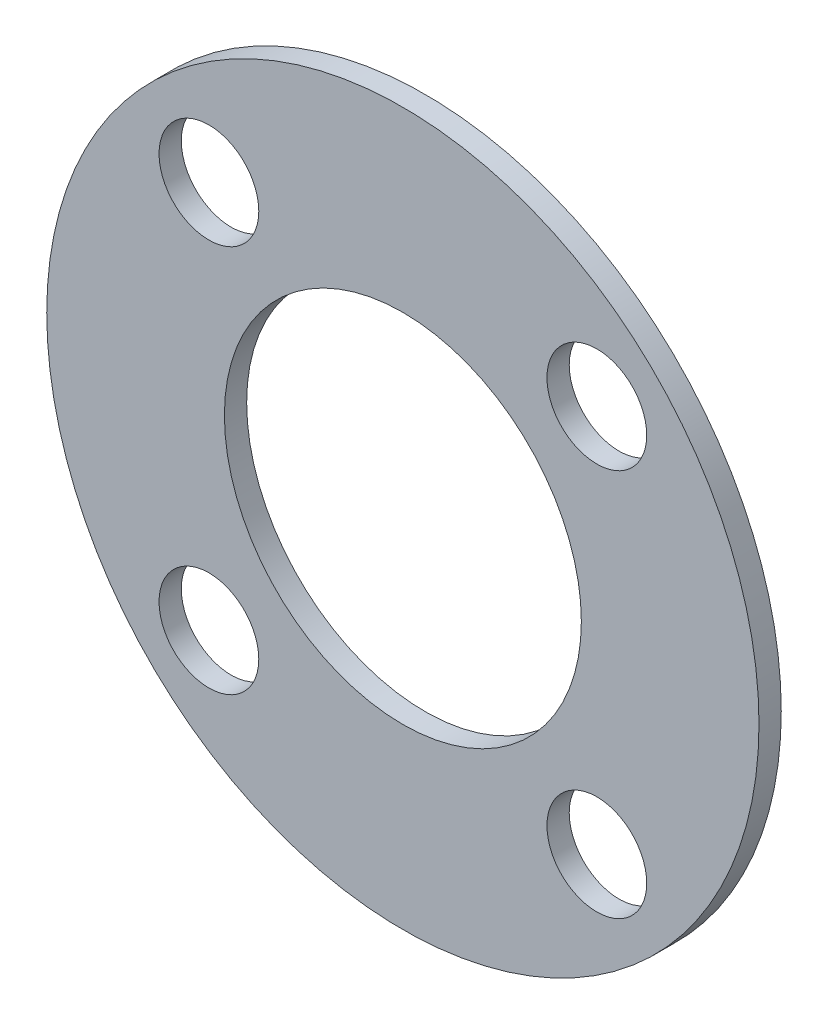
ISO-10303-21;
HEADER;
FILE_DESCRIPTION(('STEP AP214'),'2;1');
FILE_NAME('part.step','',(''),(''),'','','');
FILE_SCHEMA(('AUTOMOTIVE_DESIGN { 1 0 10303 214 1 1 1 1 }'));
ENDSEC;
DATA;
#1=APPLICATION_CONTEXT('core data for automotive mechanical design processes');
#2=APPLICATION_PROTOCOL_DEFINITION('international standard','automotive_design',2000,#1);
#3=PRODUCT_CONTEXT('',#1,'mechanical');
#4=PRODUCT('Part','Part','',(#3));
#5=PRODUCT_RELATED_PRODUCT_CATEGORY('part','',(#4));
#6=PRODUCT_DEFINITION_FORMATION('','',#4);
#7=PRODUCT_DEFINITION_CONTEXT('part definition',#1,'design');
#8=PRODUCT_DEFINITION('design','',#6,#7);
#9=PRODUCT_DEFINITION_SHAPE('','',#8);
#10=(LENGTH_UNIT() NAMED_UNIT(*) SI_UNIT(.MILLI.,.METRE.));
#11=(NAMED_UNIT(*) PLANE_ANGLE_UNIT() SI_UNIT($,.RADIAN.));
#12=(NAMED_UNIT(*) SI_UNIT($,.STERADIAN.) SOLID_ANGLE_UNIT());
#13=UNCERTAINTY_MEASURE_WITH_UNIT(LENGTH_MEASURE(1.E-05),#10,'distance_accuracy_value','');
#14=(GEOMETRIC_REPRESENTATION_CONTEXT(3) GLOBAL_UNCERTAINTY_ASSIGNED_CONTEXT((#13)) GLOBAL_UNIT_ASSIGNED_CONTEXT((#10,
#11,#12)) REPRESENTATION_CONTEXT('',''));
#15=CARTESIAN_POINT('',(0.,0.,0.));
#16=DIRECTION('',(0.,0.,1.));
#17=DIRECTION('',(1.,0.,0.));
#18=AXIS2_PLACEMENT_3D('',#15,#16,#17);
#19=CARTESIAN_POINT('',(0.,0.,6.35));
#20=DIRECTION('',(0.,0.,-1.));
#21=DIRECTION('',(-1.,0.,0.));
#22=AXIS2_PLACEMENT_3D('',#19,#20,#21);
#23=CYLINDRICAL_SURFACE('',#22,12.69619);
#24=CARTESIAN_POINT('',(0.,0.,6.35));
#25=DIRECTION('',(0.,0.,-1.));
#26=DIRECTION('',(-1.,0.,0.));
#27=AXIS2_PLACEMENT_3D('',#24,#25,#26);
#28=CIRCLE('',#27,12.69619);
#29=CARTESIAN_POINT('',(-12.69619,0.,6.35));
#30=VERTEX_POINT('',#29);
#31=EDGE_CURVE('E12',#30,#30,#28,.T.);
#32=ORIENTED_EDGE('',*,*,#31,.T.);
#33=EDGE_LOOP('',(#32));
#34=FACE_BOUND('',#33,.T.);
#35=CARTESIAN_POINT('',(0.,0.,5.55625));
#36=DIRECTION('',(0.,0.,-1.));
#37=DIRECTION('',(-1.,0.,0.));
#38=AXIS2_PLACEMENT_3D('',#35,#36,#37);
#39=CIRCLE('',#38,12.69619);
#40=CARTESIAN_POINT('',(-12.69619,0.,5.55625));
#41=VERTEX_POINT('',#40);
#42=EDGE_CURVE('E395',#41,#41,#39,.F.);
#43=ORIENTED_EDGE('',*,*,#42,.T.);
#44=EDGE_LOOP('',(#43));
#45=FACE_BOUND('',#44,.T.);
#46=ADVANCED_FACE('F57',(#34,#45),#23,.T.);
#47=CARTESIAN_POINT('',(0.,0.,0.));
#48=DIRECTION('',(0.,0.,-1.));
#49=DIRECTION('',(-1.,0.,0.));
#50=AXIS2_PLACEMENT_3D('',#47,#48,#49);
#51=CYLINDRICAL_SURFACE('',#50,6.36270000000001);
#52=CARTESIAN_POINT('',(0.,0.,6.35));
#53=DIRECTION('',(0.,0.,1.));
#54=DIRECTION('',(1.,0.,0.));
#55=AXIS2_PLACEMENT_3D('',#52,#53,#54);
#56=CIRCLE('',#55,6.36270000000001);
#57=CARTESIAN_POINT('',(6.36270000000001,0.,6.35));
#58=VERTEX_POINT('',#57);
#59=EDGE_CURVE('E67',#58,#58,#56,.T.);
#60=ORIENTED_EDGE('',*,*,#59,.T.);
#61=EDGE_LOOP('',(#60));
#62=FACE_BOUND('',#61,.T.);
#63=CARTESIAN_POINT('',(0.,0.,5.55625));
#64=DIRECTION('',(0.,0.,-1.));
#65=DIRECTION('',(-1.,0.,0.));
#66=AXIS2_PLACEMENT_3D('',#63,#64,#65);
#67=CIRCLE('',#66,6.36270000000001);
#68=CARTESIAN_POINT('',(-6.36270000000001,0.,5.55625));
#69=VERTEX_POINT('',#68);
#70=EDGE_CURVE('E399',#69,#69,#67,.F.);
#71=ORIENTED_EDGE('',*,*,#70,.F.);
#72=EDGE_LOOP('',(#71));
#73=FACE_BOUND('',#72,.T.);
#74=ADVANCED_FACE('F438',(#62,#73),#51,.F.);
#75=CARTESIAN_POINT('',(-6.91479721322323,6.91479721322326,0.));
#76=DIRECTION('',(0.,0.,-1.));
#77=DIRECTION('',(-1.,0.,0.));
#78=AXIS2_PLACEMENT_3D('',#75,#76,#77);
#79=CYLINDRICAL_SURFACE('',#78,1.77799999999998);
#80=CARTESIAN_POINT('',(-6.91479721322323,6.91479721322326,6.35));
#81=DIRECTION('',(0.,0.,1.));
#82=DIRECTION('',(1.,0.,0.));
#83=AXIS2_PLACEMENT_3D('',#80,#81,#82);
#84=CIRCLE('',#83,1.77799999999998);
#85=CARTESIAN_POINT('',(-5.13679721322325,6.91479721322326,6.35));
#86=VERTEX_POINT('',#85);
#87=EDGE_CURVE('E74',#86,#86,#84,.T.);
#88=ORIENTED_EDGE('',*,*,#87,.T.);
#89=EDGE_LOOP('',(#88));
#90=FACE_BOUND('',#89,.T.);
#91=CARTESIAN_POINT('',(-6.91479721322323,6.91479721322326,5.55625));
#92=DIRECTION('',(0.,0.,-1.));
#93=DIRECTION('',(-1.,0.,0.));
#94=AXIS2_PLACEMENT_3D('',#91,#92,#93);
#95=CIRCLE('',#94,1.77799999999998);
#96=CARTESIAN_POINT('',(-8.69279721322322,6.91479721322326,5.55625));
#97=VERTEX_POINT('',#96);
#98=EDGE_CURVE('E403',#97,#97,#95,.F.);
#99=ORIENTED_EDGE('',*,*,#98,.F.);
#100=EDGE_LOOP('',(#99));
#101=FACE_BOUND('',#100,.T.);
#102=ADVANCED_FACE('F443',(#90,#101),#79,.F.);
#103=CARTESIAN_POINT('',(6.91479721322328,6.91479721322321,0.));
#104=DIRECTION('',(0.,0.,-1.));
#105=DIRECTION('',(-1.,0.,0.));
#106=AXIS2_PLACEMENT_3D('',#103,#104,#105);
#107=CYLINDRICAL_SURFACE('',#106,1.77799999999998);
#108=CARTESIAN_POINT('',(6.91479721322328,6.91479721322321,6.35));
#109=DIRECTION('',(0.,0.,1.));
#110=DIRECTION('',(1.,0.,0.));
#111=AXIS2_PLACEMENT_3D('',#108,#109,#110);
#112=CIRCLE('',#111,1.77799999999998);
#113=CARTESIAN_POINT('',(8.69279721322327,6.91479721322321,6.35));
#114=VERTEX_POINT('',#113);
#115=EDGE_CURVE('E383',#114,#114,#112,.T.);
#116=ORIENTED_EDGE('',*,*,#115,.T.);
#117=EDGE_LOOP('',(#116));
#118=FACE_BOUND('',#117,.T.);
#119=CARTESIAN_POINT('',(6.91479721322328,6.91479721322321,5.55625));
#120=DIRECTION('',(0.,0.,-1.));
#121=DIRECTION('',(-1.,0.,0.));
#122=AXIS2_PLACEMENT_3D('',#119,#120,#121);
#123=CIRCLE('',#122,1.77799999999998);
#124=CARTESIAN_POINT('',(5.1367972132233,6.91479721322321,5.55625));
#125=VERTEX_POINT('',#124);
#126=EDGE_CURVE('E407',#125,#125,#123,.F.);
#127=ORIENTED_EDGE('',*,*,#126,.F.);
#128=EDGE_LOOP('',(#127));
#129=FACE_BOUND('',#128,.T.);
#130=ADVANCED_FACE('F433',(#118,#129),#107,.F.);
#131=CARTESIAN_POINT('',(6.91479721322323,-6.91479721322326,0.));
#132=DIRECTION('',(0.,0.,-1.));
#133=DIRECTION('',(-1.,0.,0.));
#134=AXIS2_PLACEMENT_3D('',#131,#132,#133);
#135=CYLINDRICAL_SURFACE('',#134,1.77799999999998);
#136=CARTESIAN_POINT('',(6.91479721322323,-6.91479721322326,6.35));
#137=DIRECTION('',(0.,0.,1.));
#138=DIRECTION('',(1.,0.,0.));
#139=AXIS2_PLACEMENT_3D('',#136,#137,#138);
#140=CIRCLE('',#139,1.77799999999998);
#141=CARTESIAN_POINT('',(8.69279721322322,-6.91479721322326,6.35));
#142=VERTEX_POINT('',#141);
#143=EDGE_CURVE('E387',#142,#142,#140,.T.);
#144=ORIENTED_EDGE('',*,*,#143,.T.);
#145=EDGE_LOOP('',(#144));
#146=FACE_BOUND('',#145,.T.);
#147=CARTESIAN_POINT('',(6.91479721322323,-6.91479721322326,5.55625));
#148=DIRECTION('',(0.,0.,-1.));
#149=DIRECTION('',(-1.,0.,0.));
#150=AXIS2_PLACEMENT_3D('',#147,#148,#149);
#151=CIRCLE('',#150,1.77799999999998);
#152=CARTESIAN_POINT('',(5.13679721322325,-6.91479721322326,5.55625));
#153=VERTEX_POINT('',#152);
#154=EDGE_CURVE('E411',#153,#153,#151,.F.);
#155=ORIENTED_EDGE('',*,*,#154,.F.);
#156=EDGE_LOOP('',(#155));
#157=FACE_BOUND('',#156,.T.);
#158=ADVANCED_FACE('F424',(#146,#157),#135,.F.);
#159=CARTESIAN_POINT('',(-6.91479721322333,-6.91479721322316,0.));
#160=DIRECTION('',(0.,0.,-1.));
#161=DIRECTION('',(-1.,0.,0.));
#162=AXIS2_PLACEMENT_3D('',#159,#160,#161);
#163=CYLINDRICAL_SURFACE('',#162,1.77799999999998);
#164=CARTESIAN_POINT('',(-6.91479721322333,-6.91479721322316,6.35));
#165=DIRECTION('',(0.,0.,1.));
#166=DIRECTION('',(1.,0.,0.));
#167=AXIS2_PLACEMENT_3D('',#164,#165,#166);
#168=CIRCLE('',#167,1.77799999999998);
#169=CARTESIAN_POINT('',(-5.13679721322335,-6.91479721322316,6.35));
#170=VERTEX_POINT('',#169);
#171=EDGE_CURVE('E391',#170,#170,#168,.T.);
#172=ORIENTED_EDGE('',*,*,#171,.T.);
#173=EDGE_LOOP('',(#172));
#174=FACE_BOUND('',#173,.T.);
#175=CARTESIAN_POINT('',(-6.91479721322333,-6.91479721322316,5.55625));
#176=DIRECTION('',(0.,0.,-1.));
#177=DIRECTION('',(-1.,0.,0.));
#178=AXIS2_PLACEMENT_3D('',#175,#176,#177);
#179=CIRCLE('',#178,1.77799999999998);
#180=CARTESIAN_POINT('',(-8.69279721322332,-6.91479721322316,5.55625));
#181=VERTEX_POINT('',#180);
#182=EDGE_CURVE('E62',#181,#181,#179,.F.);
#183=ORIENTED_EDGE('',*,*,#182,.F.);
#184=EDGE_LOOP('',(#183));
#185=FACE_BOUND('',#184,.T.);
#186=ADVANCED_FACE('F422',(#174,#185),#163,.F.);
#187=CARTESIAN_POINT('',(0.,0.,6.35));
#188=DIRECTION('',(0.,0.,1.));
#189=DIRECTION('',(1.,0.,0.));
#190=AXIS2_PLACEMENT_3D('',#187,#188,#189);
#191=PLANE('',#190);
#192=ORIENTED_EDGE('',*,*,#171,.F.);
#193=EDGE_LOOP('',(#192));
#194=FACE_BOUND('',#193,.T.);
#195=ORIENTED_EDGE('',*,*,#143,.F.);
#196=EDGE_LOOP('',(#195));
#197=FACE_BOUND('',#196,.T.);
#198=ORIENTED_EDGE('',*,*,#115,.F.);
#199=EDGE_LOOP('',(#198));
#200=FACE_BOUND('',#199,.T.);
#201=ORIENTED_EDGE('',*,*,#87,.F.);
#202=EDGE_LOOP('',(#201));
#203=FACE_BOUND('',#202,.T.);
#204=ORIENTED_EDGE('',*,*,#59,.F.);
#205=EDGE_LOOP('',(#204));
#206=FACE_BOUND('',#205,.T.);
#207=ORIENTED_EDGE('',*,*,#31,.F.);
#208=EDGE_LOOP('',(#207));
#209=FACE_BOUND('',#208,.T.);
#210=ADVANCED_FACE('F59',(#194,#197,#200,#203,#206,#209),#191,.T.);
#211=CARTESIAN_POINT('',(0.,0.,5.55625));
#212=DIRECTION('',(0.,0.,-1.));
#213=DIRECTION('',(-1.,0.,0.));
#214=AXIS2_PLACEMENT_3D('',#211,#212,#213);
#215=PLANE('',#214);
#216=ORIENTED_EDGE('',*,*,#42,.F.);
#217=EDGE_LOOP('',(#216));
#218=FACE_BOUND('',#217,.T.);
#219=ORIENTED_EDGE('',*,*,#182,.T.);
#220=EDGE_LOOP('',(#219));
#221=FACE_BOUND('',#220,.T.);
#222=ORIENTED_EDGE('',*,*,#154,.T.);
#223=EDGE_LOOP('',(#222));
#224=FACE_BOUND('',#223,.T.);
#225=ORIENTED_EDGE('',*,*,#126,.T.);
#226=EDGE_LOOP('',(#225));
#227=FACE_BOUND('',#226,.T.);
#228=ORIENTED_EDGE('',*,*,#98,.T.);
#229=EDGE_LOOP('',(#228));
#230=FACE_BOUND('',#229,.T.);
#231=ORIENTED_EDGE('',*,*,#70,.T.);
#232=EDGE_LOOP('',(#231));
#233=FACE_BOUND('',#232,.T.);
#234=ADVANCED_FACE('F420',(#218,#221,#224,#227,#230,#233),#215,.T.);
#235=CLOSED_SHELL('',(#46,#74,#102,#130,#158,#186,#210,#234));
#236=MANIFOLD_SOLID_BREP('B2',#235);
#237=ADVANCED_BREP_SHAPE_REPRESENTATION('',(#18,#236),#14);
#238=SHAPE_DEFINITION_REPRESENTATION(#9,#237);
ENDSEC;
END-ISO-10303-21;
